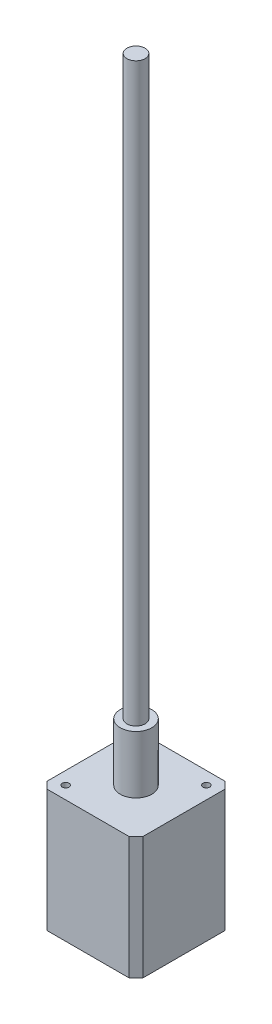
ISO-10303-21;
HEADER;
FILE_DESCRIPTION(('STEP AP214'),'2;1');
FILE_NAME('part.step','',(''),(''),'','','');
FILE_SCHEMA(('AUTOMOTIVE_DESIGN { 1 0 10303 214 1 1 1 1 }'));
ENDSEC;
DATA;
#1=APPLICATION_CONTEXT('core data for automotive mechanical design processes');
#2=APPLICATION_PROTOCOL_DEFINITION('international standard','automotive_design',2000,#1);
#3=PRODUCT_CONTEXT('',#1,'mechanical');
#4=PRODUCT('Part','Part','',(#3));
#5=PRODUCT_RELATED_PRODUCT_CATEGORY('part','',(#4));
#6=PRODUCT_DEFINITION_FORMATION('','',#4);
#7=PRODUCT_DEFINITION_CONTEXT('part definition',#1,'design');
#8=PRODUCT_DEFINITION('design','',#6,#7);
#9=PRODUCT_DEFINITION_SHAPE('','',#8);
#10=(LENGTH_UNIT() NAMED_UNIT(*) SI_UNIT(.MILLI.,.METRE.));
#11=(NAMED_UNIT(*) PLANE_ANGLE_UNIT() SI_UNIT($,.RADIAN.));
#12=(NAMED_UNIT(*) SI_UNIT($,.STERADIAN.) SOLID_ANGLE_UNIT());
#13=UNCERTAINTY_MEASURE_WITH_UNIT(LENGTH_MEASURE(1.E-05),#10,'distance_accuracy_value','');
#14=(GEOMETRIC_REPRESENTATION_CONTEXT(3) GLOBAL_UNCERTAINTY_ASSIGNED_CONTEXT((#13)) GLOBAL_UNIT_ASSIGNED_CONTEXT((#10,
#11,#12)) REPRESENTATION_CONTEXT('',''));
#15=CARTESIAN_POINT('',(0.,0.,0.));
#16=DIRECTION('',(0.,0.,1.));
#17=DIRECTION('',(1.,0.,0.));
#18=AXIS2_PLACEMENT_3D('',#15,#16,#17);
#19=CARTESIAN_POINT('',(0.,54.,0.));
#20=DIRECTION('',(1.,0.,0.));
#21=DIRECTION('',(0.,0.,-1.));
#22=AXIS2_PLACEMENT_3D('',#19,#20,#21);
#23=PLANE('',#22);
#24=DIRECTION('',(0.,0.,1.));
#25=VECTOR('',#24,1.);
#26=CARTESIAN_POINT('',(0.,54.,0.));
#27=LINE('',#26,#25);
#28=CARTESIAN_POINT('',(0.,54.,-39.25));
#29=VERTEX_POINT('',#28);
#30=CARTESIAN_POINT('',(0.,54.,-3.00000000000002));
#31=VERTEX_POINT('',#30);
#32=EDGE_CURVE('E130',#29,#31,#27,.T.);
#33=ORIENTED_EDGE('',*,*,#32,.F.);
#34=DIRECTION('',(0.,-1.,0.));
#35=VECTOR('',#34,1.);
#36=CARTESIAN_POINT('',(0.,54.,-39.25));
#37=LINE('',#36,#35);
#38=CARTESIAN_POINT('',(0.,0.,-39.25));
#39=VERTEX_POINT('',#38);
#40=EDGE_CURVE('E114',#29,#39,#37,.T.);
#41=ORIENTED_EDGE('',*,*,#40,.T.);
#42=DIRECTION('',(0.,0.,1.));
#43=VECTOR('',#42,1.);
#44=CARTESIAN_POINT('',(0.,0.,0.));
#45=LINE('',#44,#43);
#46=CARTESIAN_POINT('',(0.,0.,-3.00000000000002));
#47=VERTEX_POINT('',#46);
#48=EDGE_CURVE('E127',#39,#47,#45,.T.);
#49=ORIENTED_EDGE('',*,*,#48,.T.);
#50=DIRECTION('',(0.,1.,0.));
#51=VECTOR('',#50,1.);
#52=CARTESIAN_POINT('',(0.,54.,-3.00000000000002));
#53=LINE('',#52,#51);
#54=EDGE_CURVE('E133',#47,#31,#53,.T.);
#55=ORIENTED_EDGE('',*,*,#54,.T.);
#56=EDGE_LOOP('',(#33,#41,#49,#55));
#57=FACE_BOUND('',#56,.T.);
#58=ADVANCED_FACE('F41',(#57),#23,.F.);
#59=CARTESIAN_POINT('',(0.,54.,0.));
#60=DIRECTION('',(0.,0.,-1.));
#61=DIRECTION('',(-1.,0.,0.));
#62=AXIS2_PLACEMENT_3D('',#59,#60,#61);
#63=PLANE('',#62);
#64=DIRECTION('',(1.,0.,0.));
#65=VECTOR('',#64,1.);
#66=CARTESIAN_POINT('',(0.,54.,0.));
#67=LINE('',#66,#65);
#68=CARTESIAN_POINT('',(3.00000000000002,54.,0.));
#69=VERTEX_POINT('',#68);
#70=CARTESIAN_POINT('',(39.25,54.,0.));
#71=VERTEX_POINT('',#70);
#72=EDGE_CURVE('E207',#69,#71,#67,.T.);
#73=ORIENTED_EDGE('',*,*,#72,.F.);
#74=DIRECTION('',(0.,-1.,0.));
#75=VECTOR('',#74,1.);
#76=CARTESIAN_POINT('',(3.00000000000002,54.,0.));
#77=LINE('',#76,#75);
#78=CARTESIAN_POINT('',(3.00000000000002,0.,0.));
#79=VERTEX_POINT('',#78);
#80=EDGE_CURVE('E186',#69,#79,#77,.T.);
#81=ORIENTED_EDGE('',*,*,#80,.T.);
#82=DIRECTION('',(1.,0.,0.));
#83=VECTOR('',#82,1.);
#84=CARTESIAN_POINT('',(0.,0.,0.));
#85=LINE('',#84,#83);
#86=CARTESIAN_POINT('',(39.25,0.,0.));
#87=VERTEX_POINT('',#86);
#88=EDGE_CURVE('E138',#79,#87,#85,.T.);
#89=ORIENTED_EDGE('',*,*,#88,.T.);
#90=DIRECTION('',(0.,1.,0.));
#91=VECTOR('',#90,1.);
#92=CARTESIAN_POINT('',(39.25,54.,0.));
#93=LINE('',#92,#91);
#94=EDGE_CURVE('E183',#87,#71,#93,.T.);
#95=ORIENTED_EDGE('',*,*,#94,.T.);
#96=EDGE_LOOP('',(#73,#81,#89,#95));
#97=FACE_BOUND('',#96,.T.);
#98=ADVANCED_FACE('F260',(#97),#63,.F.);
#99=CARTESIAN_POINT('',(42.25,54.,0.));
#100=DIRECTION('',(-1.,0.,0.));
#101=DIRECTION('',(0.,0.,1.));
#102=AXIS2_PLACEMENT_3D('',#99,#100,#101);
#103=PLANE('',#102);
#104=DIRECTION('',(0.,0.,-1.));
#105=VECTOR('',#104,1.);
#106=CARTESIAN_POINT('',(42.25,54.,0.));
#107=LINE('',#106,#105);
#108=CARTESIAN_POINT('',(42.25,54.,-3.00000000000002));
#109=VERTEX_POINT('',#108);
#110=CARTESIAN_POINT('',(42.25,54.,-39.25));
#111=VERTEX_POINT('',#110);
#112=EDGE_CURVE('E196',#109,#111,#107,.T.);
#113=ORIENTED_EDGE('',*,*,#112,.F.);
#114=DIRECTION('',(0.,-1.,0.));
#115=VECTOR('',#114,1.);
#116=CARTESIAN_POINT('',(42.25,54.,-3.00000000000002));
#117=LINE('',#116,#115);
#118=CARTESIAN_POINT('',(42.25,0.,-3.00000000000002));
#119=VERTEX_POINT('',#118);
#120=EDGE_CURVE('E51',#109,#119,#117,.T.);
#121=ORIENTED_EDGE('',*,*,#120,.T.);
#122=DIRECTION('',(0.,0.,-1.));
#123=VECTOR('',#122,1.);
#124=CARTESIAN_POINT('',(42.25,0.,0.));
#125=LINE('',#124,#123);
#126=CARTESIAN_POINT('',(42.25,0.,-39.25));
#127=VERTEX_POINT('',#126);
#128=EDGE_CURVE('E144',#119,#127,#125,.T.);
#129=ORIENTED_EDGE('',*,*,#128,.T.);
#130=DIRECTION('',(0.,1.,0.));
#131=VECTOR('',#130,1.);
#132=CARTESIAN_POINT('',(42.25,54.,-39.25));
#133=LINE('',#132,#131);
#134=EDGE_CURVE('E58',#127,#111,#133,.T.);
#135=ORIENTED_EDGE('',*,*,#134,.T.);
#136=EDGE_LOOP('',(#113,#121,#129,#135));
#137=FACE_BOUND('',#136,.T.);
#138=ADVANCED_FACE('F195',(#137),#103,.F.);
#139=CARTESIAN_POINT('',(0.,54.,-42.25));
#140=DIRECTION('',(0.,0.,1.));
#141=DIRECTION('',(1.,0.,0.));
#142=AXIS2_PLACEMENT_3D('',#139,#140,#141);
#143=PLANE('',#142);
#144=DIRECTION('',(-1.,0.,0.));
#145=VECTOR('',#144,1.);
#146=CARTESIAN_POINT('',(0.,0.,-42.25));
#147=LINE('',#146,#145);
#148=CARTESIAN_POINT('',(39.25,0.,-42.25));
#149=VERTEX_POINT('',#148);
#150=CARTESIAN_POINT('',(3.00000000000002,0.,-42.25));
#151=VERTEX_POINT('',#150);
#152=EDGE_CURVE('E155',#149,#151,#147,.T.);
#153=ORIENTED_EDGE('',*,*,#152,.T.);
#154=DIRECTION('',(0.,1.,0.));
#155=VECTOR('',#154,1.);
#156=CARTESIAN_POINT('',(3.00000000000002,54.,-42.25));
#157=LINE('',#156,#155);
#158=CARTESIAN_POINT('',(3.00000000000002,54.,-42.25));
#159=VERTEX_POINT('',#158);
#160=EDGE_CURVE('E115',#151,#159,#157,.T.);
#161=ORIENTED_EDGE('',*,*,#160,.T.);
#162=DIRECTION('',(-1.,0.,0.));
#163=VECTOR('',#162,1.);
#164=CARTESIAN_POINT('',(0.,54.,-42.25));
#165=LINE('',#164,#163);
#166=CARTESIAN_POINT('',(39.25,54.,-42.25));
#167=VERTEX_POINT('',#166);
#168=EDGE_CURVE('E150',#167,#159,#165,.T.);
#169=ORIENTED_EDGE('',*,*,#168,.F.);
#170=DIRECTION('',(0.,-1.,0.));
#171=VECTOR('',#170,1.);
#172=CARTESIAN_POINT('',(39.25,54.,-42.25));
#173=LINE('',#172,#171);
#174=EDGE_CURVE('E121',#167,#149,#173,.T.);
#175=ORIENTED_EDGE('',*,*,#174,.T.);
#176=EDGE_LOOP('',(#153,#161,#169,#175));
#177=FACE_BOUND('',#176,.T.);
#178=ADVANCED_FACE('F203',(#177),#143,.F.);
#179=CARTESIAN_POINT('',(0.,54.,0.));
#180=DIRECTION('',(0.,-1.,0.));
#181=DIRECTION('',(0.,0.,-1.));
#182=AXIS2_PLACEMENT_3D('',#179,#180,#181);
#183=PLANE('',#182);
#184=CARTESIAN_POINT('',(21.125,54.,-21.125));
#185=DIRECTION('',(0.,-1.,0.));
#186=DIRECTION('',(0.,0.,-1.));
#187=AXIS2_PLACEMENT_3D('',#184,#185,#186);
#188=CIRCLE('',#187,6.94999999999999);
#189=CARTESIAN_POINT('',(21.125,54.,-28.075));
#190=VERTEX_POINT('',#189);
#191=EDGE_CURVE('E11',#190,#190,#188,.F.);
#192=ORIENTED_EDGE('',*,*,#191,.F.);
#193=EDGE_LOOP('',(#192));
#194=FACE_BOUND('',#193,.T.);
#195=CARTESIAN_POINT('',(36.625,54.,-36.625));
#196=DIRECTION('',(0.,1.,0.));
#197=DIRECTION('',(0.,0.,1.));
#198=AXIS2_PLACEMENT_3D('',#195,#196,#197);
#199=CIRCLE('',#198,1.5);
#200=CARTESIAN_POINT('',(36.625,54.,-35.125));
#201=VERTEX_POINT('',#200);
#202=EDGE_CURVE('E147',#201,#201,#199,.T.);
#203=ORIENTED_EDGE('',*,*,#202,.F.);
#204=EDGE_LOOP('',(#203));
#205=FACE_BOUND('',#204,.T.);
#206=CARTESIAN_POINT('',(5.62500000000001,54.,-5.62500000000001));
#207=DIRECTION('',(0.,1.,0.));
#208=DIRECTION('',(0.,0.,1.));
#209=AXIS2_PLACEMENT_3D('',#206,#207,#208);
#210=CIRCLE('',#209,1.5);
#211=CARTESIAN_POINT('',(5.62500000000001,54.,-4.12500000000001));
#212=VERTEX_POINT('',#211);
#213=EDGE_CURVE('E213',#212,#212,#210,.T.);
#214=ORIENTED_EDGE('',*,*,#213,.F.);
#215=EDGE_LOOP('',(#214));
#216=FACE_BOUND('',#215,.T.);
#217=ORIENTED_EDGE('',*,*,#168,.T.);
#218=DIRECTION('',(0.707106781186548,0.,-0.707106781186547));
#219=VECTOR('',#218,1.);
#220=CARTESIAN_POINT('',(0.,54.,-39.25));
#221=LINE('',#220,#219);
#222=EDGE_CURVE('E180',#159,#29,#221,.F.);
#223=ORIENTED_EDGE('',*,*,#222,.T.);
#224=ORIENTED_EDGE('',*,*,#32,.T.);
#225=DIRECTION('',(-0.707106781186547,0.,-0.707106781186548));
#226=VECTOR('',#225,1.);
#227=CARTESIAN_POINT('',(3.00000000000002,54.,0.));
#228=LINE('',#227,#226);
#229=EDGE_CURVE('E177',#31,#69,#228,.F.);
#230=ORIENTED_EDGE('',*,*,#229,.T.);
#231=ORIENTED_EDGE('',*,*,#72,.T.);
#232=DIRECTION('',(-0.707106781186548,0.,0.707106781186547));
#233=VECTOR('',#232,1.);
#234=CARTESIAN_POINT('',(42.25,54.,-3.00000000000002));
#235=LINE('',#234,#233);
#236=EDGE_CURVE('E65',#71,#109,#235,.F.);
#237=ORIENTED_EDGE('',*,*,#236,.T.);
#238=ORIENTED_EDGE('',*,*,#112,.T.);
#239=DIRECTION('',(0.707106781186547,0.,0.707106781186548));
#240=VECTOR('',#239,1.);
#241=CARTESIAN_POINT('',(39.25,54.,-42.25));
#242=LINE('',#241,#240);
#243=EDGE_CURVE('E172',#111,#167,#242,.F.);
#244=ORIENTED_EDGE('',*,*,#243,.T.);
#245=EDGE_LOOP('',(#217,#223,#224,#230,#231,#237,#238,#244));
#246=FACE_BOUND('',#245,.T.);
#247=ADVANCED_FACE('F290',(#194,#205,#216,#246),#183,.F.);
#248=CARTESIAN_POINT('',(0.,0.,0.));
#249=DIRECTION('',(0.,-1.,0.));
#250=DIRECTION('',(0.,0.,-1.));
#251=AXIS2_PLACEMENT_3D('',#248,#249,#250);
#252=PLANE('',#251);
#253=ORIENTED_EDGE('',*,*,#48,.F.);
#254=DIRECTION('',(-0.707106781186548,0.,0.707106781186547));
#255=VECTOR('',#254,1.);
#256=CARTESIAN_POINT('',(-19.625,0.,-19.625));
#257=LINE('',#256,#255);
#258=EDGE_CURVE('E110',#39,#151,#257,.F.);
#259=ORIENTED_EDGE('',*,*,#258,.T.);
#260=ORIENTED_EDGE('',*,*,#152,.F.);
#261=DIRECTION('',(-0.707106781186547,0.,-0.707106781186548));
#262=VECTOR('',#261,1.);
#263=CARTESIAN_POINT('',(40.75,0.,-40.7499999999999));
#264=LINE('',#263,#262);
#265=EDGE_CURVE('E132',#149,#127,#264,.F.);
#266=ORIENTED_EDGE('',*,*,#265,.T.);
#267=ORIENTED_EDGE('',*,*,#128,.F.);
#268=DIRECTION('',(0.707106781186548,0.,-0.707106781186547));
#269=VECTOR('',#268,1.);
#270=CARTESIAN_POINT('',(19.6249999999999,0.,19.625));
#271=LINE('',#270,#269);
#272=EDGE_CURVE('E162',#119,#87,#271,.F.);
#273=ORIENTED_EDGE('',*,*,#272,.T.);
#274=ORIENTED_EDGE('',*,*,#88,.F.);
#275=DIRECTION('',(0.707106781186547,0.,0.707106781186548));
#276=VECTOR('',#275,1.);
#277=CARTESIAN_POINT('',(1.50000000000001,0.,-1.50000000000001));
#278=LINE('',#277,#276);
#279=EDGE_CURVE('E122',#79,#47,#278,.F.);
#280=ORIENTED_EDGE('',*,*,#279,.T.);
#281=EDGE_LOOP('',(#253,#259,#260,#266,#267,#273,#274,#280));
#282=FACE_BOUND('',#281,.T.);
#283=ADVANCED_FACE('F135',(#282),#252,.T.);
#284=CARTESIAN_POINT('',(5.62500000000001,51.,-5.62500000000001));
#285=DIRECTION('',(0.,1.,0.));
#286=DIRECTION('',(0.,0.,1.));
#287=AXIS2_PLACEMENT_3D('',#284,#285,#286);
#288=CYLINDRICAL_SURFACE('',#287,1.5);
#289=CARTESIAN_POINT('',(5.62500000000001,51.,-5.62500000000001));
#290=DIRECTION('',(0.,1.,0.));
#291=DIRECTION('',(0.,0.,1.));
#292=AXIS2_PLACEMENT_3D('',#289,#290,#291);
#293=CIRCLE('',#292,1.5);
#294=CARTESIAN_POINT('',(5.62500000000001,51.,-4.12500000000001));
#295=VERTEX_POINT('',#294);
#296=EDGE_CURVE('E217',#295,#295,#293,.T.);
#297=ORIENTED_EDGE('',*,*,#296,.F.);
#298=EDGE_LOOP('',(#297));
#299=FACE_BOUND('',#298,.T.);
#300=ORIENTED_EDGE('',*,*,#213,.T.);
#301=EDGE_LOOP('',(#300));
#302=FACE_BOUND('',#301,.T.);
#303=ADVANCED_FACE('F299',(#299,#302),#288,.F.);
#304=CARTESIAN_POINT('',(5.62500000000001,51.,-5.62500000000001));
#305=DIRECTION('',(0.,1.,0.));
#306=DIRECTION('',(0.,0.,1.));
#307=AXIS2_PLACEMENT_3D('',#304,#305,#306);
#308=PLANE('',#307);
#309=ORIENTED_EDGE('',*,*,#296,.T.);
#310=EDGE_LOOP('',(#309));
#311=FACE_BOUND('',#310,.T.);
#312=ADVANCED_FACE('F389',(#311),#308,.T.);
#313=CARTESIAN_POINT('',(36.625,51.,-36.625));
#314=DIRECTION('',(0.,1.,0.));
#315=DIRECTION('',(0.,0.,1.));
#316=AXIS2_PLACEMENT_3D('',#313,#314,#315);
#317=CYLINDRICAL_SURFACE('',#316,1.5);
#318=CARTESIAN_POINT('',(36.625,51.,-36.625));
#319=DIRECTION('',(0.,1.,0.));
#320=DIRECTION('',(0.,0.,1.));
#321=AXIS2_PLACEMENT_3D('',#318,#319,#320);
#322=CIRCLE('',#321,1.5);
#323=CARTESIAN_POINT('',(36.625,51.,-35.125));
#324=VERTEX_POINT('',#323);
#325=EDGE_CURVE('E139',#324,#324,#322,.T.);
#326=ORIENTED_EDGE('',*,*,#325,.F.);
#327=EDGE_LOOP('',(#326));
#328=FACE_BOUND('',#327,.T.);
#329=ORIENTED_EDGE('',*,*,#202,.T.);
#330=EDGE_LOOP('',(#329));
#331=FACE_BOUND('',#330,.T.);
#332=ADVANCED_FACE('F383',(#328,#331),#317,.F.);
#333=CARTESIAN_POINT('',(36.625,51.,-36.625));
#334=DIRECTION('',(0.,1.,0.));
#335=DIRECTION('',(0.,0.,1.));
#336=AXIS2_PLACEMENT_3D('',#333,#334,#335);
#337=PLANE('',#336);
#338=ORIENTED_EDGE('',*,*,#325,.T.);
#339=EDGE_LOOP('',(#338));
#340=FACE_BOUND('',#339,.T.);
#341=ADVANCED_FACE('F276',(#340),#337,.T.);
#342=CARTESIAN_POINT('',(0.,54.,-39.25));
#343=DIRECTION('',(0.707106781186547,0.,0.707106781186548));
#344=DIRECTION('',(0.,-1.,0.));
#345=AXIS2_PLACEMENT_3D('',#342,#343,#344);
#346=PLANE('',#345);
#347=ORIENTED_EDGE('',*,*,#222,.F.);
#348=ORIENTED_EDGE('',*,*,#160,.F.);
#349=ORIENTED_EDGE('',*,*,#258,.F.);
#350=ORIENTED_EDGE('',*,*,#40,.F.);
#351=EDGE_LOOP('',(#347,#348,#349,#350));
#352=FACE_BOUND('',#351,.T.);
#353=ADVANCED_FACE('F113',(#352),#346,.F.);
#354=CARTESIAN_POINT('',(3.00000000000002,54.,0.));
#355=DIRECTION('',(0.707106781186548,0.,-0.707106781186547));
#356=DIRECTION('',(0.,-1.,0.));
#357=AXIS2_PLACEMENT_3D('',#354,#355,#356);
#358=PLANE('',#357);
#359=ORIENTED_EDGE('',*,*,#229,.F.);
#360=ORIENTED_EDGE('',*,*,#54,.F.);
#361=ORIENTED_EDGE('',*,*,#279,.F.);
#362=ORIENTED_EDGE('',*,*,#80,.F.);
#363=EDGE_LOOP('',(#359,#360,#361,#362));
#364=FACE_BOUND('',#363,.T.);
#365=ADVANCED_FACE('F275',(#364),#358,.F.);
#366=CARTESIAN_POINT('',(42.25,54.,-3.00000000000002));
#367=DIRECTION('',(-0.707106781186547,0.,-0.707106781186548));
#368=DIRECTION('',(0.,-1.,0.));
#369=AXIS2_PLACEMENT_3D('',#366,#367,#368);
#370=PLANE('',#369);
#371=ORIENTED_EDGE('',*,*,#236,.F.);
#372=ORIENTED_EDGE('',*,*,#94,.F.);
#373=ORIENTED_EDGE('',*,*,#272,.F.);
#374=ORIENTED_EDGE('',*,*,#120,.F.);
#375=EDGE_LOOP('',(#371,#372,#373,#374));
#376=FACE_BOUND('',#375,.T.);
#377=ADVANCED_FACE('F257',(#376),#370,.F.);
#378=CARTESIAN_POINT('',(39.25,54.,-42.25));
#379=DIRECTION('',(-0.707106781186548,0.,0.707106781186547));
#380=DIRECTION('',(0.,-1.,0.));
#381=AXIS2_PLACEMENT_3D('',#378,#379,#380);
#382=PLANE('',#381);
#383=ORIENTED_EDGE('',*,*,#243,.F.);
#384=ORIENTED_EDGE('',*,*,#134,.F.);
#385=ORIENTED_EDGE('',*,*,#265,.F.);
#386=ORIENTED_EDGE('',*,*,#174,.F.);
#387=EDGE_LOOP('',(#383,#384,#385,#386));
#388=FACE_BOUND('',#387,.T.);
#389=ADVANCED_FACE('F44',(#388),#382,.F.);
#390=CARTESIAN_POINT('',(21.125,333.4,-21.125));
#391=DIRECTION('',(0.,-1.,0.));
#392=DIRECTION('',(0.,0.,-1.));
#393=AXIS2_PLACEMENT_3D('',#390,#391,#392);
#394=PLANE('',#393);
#395=CARTESIAN_POINT('',(21.125,333.4,-21.125));
#396=DIRECTION('',(0.,-1.,0.));
#397=DIRECTION('',(0.,0.,-1.));
#398=AXIS2_PLACEMENT_3D('',#395,#396,#397);
#399=CIRCLE('',#398,4.);
#400=CARTESIAN_POINT('',(21.125,333.4,-25.125));
#401=VERTEX_POINT('',#400);
#402=EDGE_CURVE('E218',#401,#401,#399,.T.);
#403=ORIENTED_EDGE('',*,*,#402,.F.);
#404=EDGE_LOOP('',(#403));
#405=FACE_BOUND('',#404,.T.);
#406=ADVANCED_FACE('F248',(#405),#394,.F.);
#407=CARTESIAN_POINT('',(21.125,54.,-21.125));
#408=DIRECTION('',(0.,-1.,0.));
#409=DIRECTION('',(0.,0.,-1.));
#410=AXIS2_PLACEMENT_3D('',#407,#408,#409);
#411=CYLINDRICAL_SURFACE('',#410,3.99999999999998);
#412=CARTESIAN_POINT('',(21.125,79.4,-21.125));
#413=DIRECTION('',(0.,-1.,0.));
#414=DIRECTION('',(0.,0.,-1.));
#415=AXIS2_PLACEMENT_3D('',#412,#413,#414);
#416=CIRCLE('',#415,3.99999999999996);
#417=CARTESIAN_POINT('',(21.125,79.4,-25.125));
#418=VERTEX_POINT('',#417);
#419=EDGE_CURVE('E228',#418,#418,#416,.T.);
#420=ORIENTED_EDGE('',*,*,#419,.F.);
#421=EDGE_LOOP('',(#420));
#422=FACE_BOUND('',#421,.T.);
#423=ORIENTED_EDGE('',*,*,#402,.T.);
#424=EDGE_LOOP('',(#423));
#425=FACE_BOUND('',#424,.T.);
#426=ADVANCED_FACE('F242',(#422,#425),#411,.T.);
#427=CARTESIAN_POINT('',(21.125,79.4,-25.125));
#428=DIRECTION('',(0.,-1.,0.));
#429=DIRECTION('',(0.,0.,-1.));
#430=AXIS2_PLACEMENT_3D('',#427,#428,#429);
#431=PLANE('',#430);
#432=CARTESIAN_POINT('',(21.125,79.4,-21.125));
#433=DIRECTION('',(0.,-1.,0.));
#434=DIRECTION('',(0.,0.,-1.));
#435=AXIS2_PLACEMENT_3D('',#432,#433,#434);
#436=CIRCLE('',#435,6.94999999999999);
#437=CARTESIAN_POINT('',(21.125,79.4,-28.075));
#438=VERTEX_POINT('',#437);
#439=EDGE_CURVE('E232',#438,#438,#436,.T.);
#440=ORIENTED_EDGE('',*,*,#439,.F.);
#441=EDGE_LOOP('',(#440));
#442=FACE_BOUND('',#441,.T.);
#443=ORIENTED_EDGE('',*,*,#419,.T.);
#444=EDGE_LOOP('',(#443));
#445=FACE_BOUND('',#444,.T.);
#446=ADVANCED_FACE('F239',(#442,#445),#431,.F.);
#447=CARTESIAN_POINT('',(21.125,54.,-21.125));
#448=DIRECTION('',(0.,-1.,0.));
#449=DIRECTION('',(0.,0.,-1.));
#450=AXIS2_PLACEMENT_3D('',#447,#448,#449);
#451=CYLINDRICAL_SURFACE('',#450,6.94999999999999);
#452=ORIENTED_EDGE('',*,*,#191,.T.);
#453=EDGE_LOOP('',(#452));
#454=FACE_BOUND('',#453,.T.);
#455=ORIENTED_EDGE('',*,*,#439,.T.);
#456=EDGE_LOOP('',(#455));
#457=FACE_BOUND('',#456,.T.);
#458=ADVANCED_FACE('F237',(#454,#457),#451,.T.);
#459=CLOSED_SHELL('',(#58,#98,#138,#178,#247,#283,#303,#312,#332,#341,#353,#365,#377,#389,#406,
#426,#446,#458));
#460=MANIFOLD_SOLID_BREP('B2',#459);
#461=ADVANCED_BREP_SHAPE_REPRESENTATION('',(#18,#460),#14);
#462=SHAPE_DEFINITION_REPRESENTATION(#9,#461);
ENDSEC;
END-ISO-10303-21;
